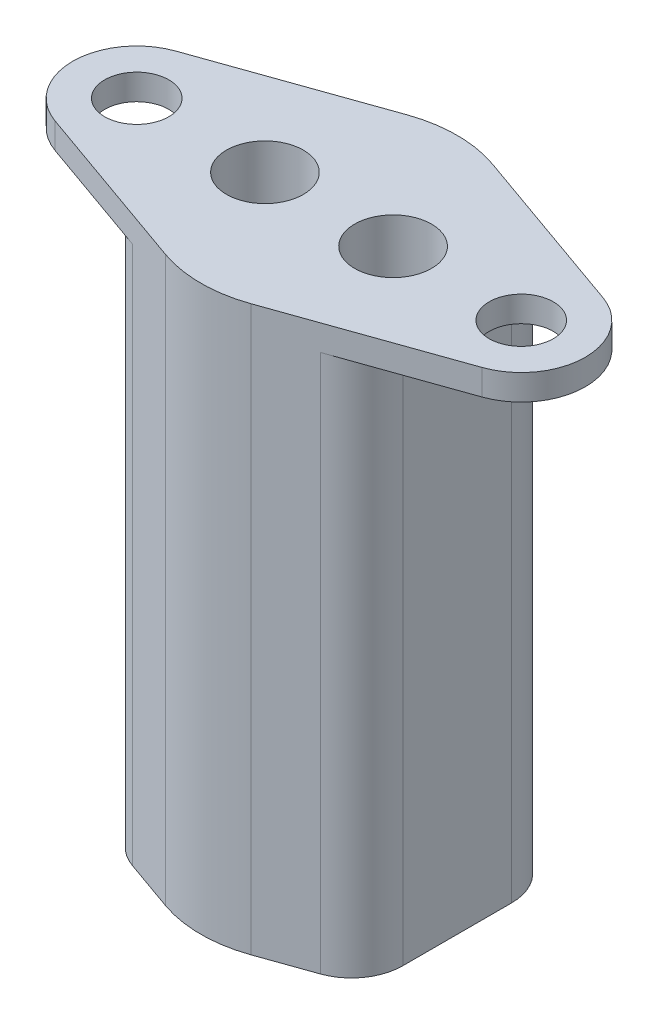
ISO-10303-21;
HEADER;
FILE_DESCRIPTION(('STEP AP214'),'2;1');
FILE_NAME('part.step','',(''),(''),'','','');
FILE_SCHEMA(('AUTOMOTIVE_DESIGN { 1 0 10303 214 1 1 1 1 }'));
ENDSEC;
DATA;
#1=APPLICATION_CONTEXT('core data for automotive mechanical design processes');
#2=APPLICATION_PROTOCOL_DEFINITION('international standard','automotive_design',2000,#1);
#3=PRODUCT_CONTEXT('',#1,'mechanical');
#4=PRODUCT('Part','Part','',(#3));
#5=PRODUCT_RELATED_PRODUCT_CATEGORY('part','',(#4));
#6=PRODUCT_DEFINITION_FORMATION('','',#4);
#7=PRODUCT_DEFINITION_CONTEXT('part definition',#1,'design');
#8=PRODUCT_DEFINITION('design','',#6,#7);
#9=PRODUCT_DEFINITION_SHAPE('','',#8);
#10=(LENGTH_UNIT() NAMED_UNIT(*) SI_UNIT(.MILLI.,.METRE.));
#11=(NAMED_UNIT(*) PLANE_ANGLE_UNIT() SI_UNIT($,.RADIAN.));
#12=(NAMED_UNIT(*) SI_UNIT($,.STERADIAN.) SOLID_ANGLE_UNIT());
#13=UNCERTAINTY_MEASURE_WITH_UNIT(LENGTH_MEASURE(1.E-05),#10,'distance_accuracy_value','');
#14=(GEOMETRIC_REPRESENTATION_CONTEXT(3) GLOBAL_UNCERTAINTY_ASSIGNED_CONTEXT((#13)) GLOBAL_UNIT_ASSIGNED_CONTEXT((#10,
#11,#12)) REPRESENTATION_CONTEXT('',''));
#15=CARTESIAN_POINT('',(0.,0.,0.));
#16=DIRECTION('',(0.,0.,1.));
#17=DIRECTION('',(1.,0.,0.));
#18=AXIS2_PLACEMENT_3D('',#15,#16,#17);
#19=CARTESIAN_POINT('',(-7.5,2.,0.));
#20=DIRECTION('',(0.,1.,0.));
#21=DIRECTION('',(0.,0.,1.));
#22=AXIS2_PLACEMENT_3D('',#19,#20,#21);
#23=PLANE('',#22);
#24=CARTESIAN_POINT('',(-2.5,2.,0.));
#25=DIRECTION('',(0.,-1.,0.));
#26=DIRECTION('',(0.,0.,-1.));
#27=AXIS2_PLACEMENT_3D('',#24,#25,#26);
#28=CIRCLE('',#27,1.5);
#29=CARTESIAN_POINT('',(-2.5,2.,-1.5));
#30=VERTEX_POINT('',#29);
#31=EDGE_CURVE('E186',#30,#30,#28,.T.);
#32=ORIENTED_EDGE('',*,*,#31,.T.);
#33=EDGE_LOOP('',(#32));
#34=FACE_BOUND('',#33,.T.);
#35=CARTESIAN_POINT('',(2.5,2.,0.));
#36=DIRECTION('',(0.,-1.,0.));
#37=DIRECTION('',(0.,0.,-1.));
#38=AXIS2_PLACEMENT_3D('',#35,#36,#37);
#39=CIRCLE('',#38,1.5);
#40=CARTESIAN_POINT('',(2.5,2.,-1.5));
#41=VERTEX_POINT('',#40);
#42=EDGE_CURVE('E633',#41,#41,#39,.T.);
#43=ORIENTED_EDGE('',*,*,#42,.T.);
#44=EDGE_LOOP('',(#43));
#45=FACE_BOUND('',#44,.T.);
#46=CARTESIAN_POINT('',(-7.5,2.,0.));
#47=DIRECTION('',(0.,1.,0.));
#48=DIRECTION('',(0.,0.,1.));
#49=AXIS2_PLACEMENT_3D('',#46,#47,#48);
#50=CIRCLE('',#49,1.25);
#51=CARTESIAN_POINT('',(-7.5,2.,1.25));
#52=VERTEX_POINT('',#51);
#53=EDGE_CURVE('E263',#52,#52,#50,.T.);
#54=ORIENTED_EDGE('',*,*,#53,.F.);
#55=EDGE_LOOP('',(#54));
#56=FACE_BOUND('',#55,.T.);
#57=CARTESIAN_POINT('',(-7.5,2.,0.));
#58=DIRECTION('',(0.,1.,0.));
#59=DIRECTION('',(0.,0.,1.));
#60=AXIS2_PLACEMENT_3D('',#57,#58,#59);
#61=CIRCLE('',#60,2.5);
#62=CARTESIAN_POINT('',(-8.33333333333333,2.,-2.35702260395516));
#63=VERTEX_POINT('',#62);
#64=CARTESIAN_POINT('',(-8.33333333333333,2.,2.35702260395516));
#65=VERTEX_POINT('',#64);
#66=EDGE_CURVE('E267',#63,#65,#61,.T.);
#67=ORIENTED_EDGE('',*,*,#66,.T.);
#68=DIRECTION('',(0.942809041582063,0.,0.333333333333333));
#69=VECTOR('',#68,1.);
#70=CARTESIAN_POINT('',(-8.33333333333333,2.,2.35702260395516));
#71=LINE('',#70,#69);
#72=CARTESIAN_POINT('',(-1.66666666666667,2.,4.71404520791032));
#73=VERTEX_POINT('',#72);
#74=EDGE_CURVE('E271',#65,#73,#71,.T.);
#75=ORIENTED_EDGE('',*,*,#74,.T.);
#76=CARTESIAN_POINT('',(0.,2.,0.));
#77=DIRECTION('',(0.,1.,0.));
#78=DIRECTION('',(0.,0.,1.));
#79=AXIS2_PLACEMENT_3D('',#76,#77,#78);
#80=CIRCLE('',#79,5.);
#81=CARTESIAN_POINT('',(1.66666666666667,2.,4.71404520791032));
#82=VERTEX_POINT('',#81);
#83=EDGE_CURVE('E274',#73,#82,#80,.T.);
#84=ORIENTED_EDGE('',*,*,#83,.T.);
#85=DIRECTION('',(0.942809041582063,0.,-0.333333333333334));
#86=VECTOR('',#85,1.);
#87=CARTESIAN_POINT('',(1.66666666666667,2.,4.71404520791032));
#88=LINE('',#87,#86);
#89=CARTESIAN_POINT('',(8.33333333333333,2.,2.35702260395515));
#90=VERTEX_POINT('',#89);
#91=EDGE_CURVE('E277',#82,#90,#88,.T.);
#92=ORIENTED_EDGE('',*,*,#91,.T.);
#93=CARTESIAN_POINT('',(7.5,2.,0.));
#94=DIRECTION('',(0.,1.,0.));
#95=DIRECTION('',(0.,0.,1.));
#96=AXIS2_PLACEMENT_3D('',#93,#94,#95);
#97=CIRCLE('',#96,2.5);
#98=CARTESIAN_POINT('',(8.33333333333333,2.,-2.35702260395516));
#99=VERTEX_POINT('',#98);
#100=EDGE_CURVE('E280',#90,#99,#97,.T.);
#101=ORIENTED_EDGE('',*,*,#100,.T.);
#102=DIRECTION('',(-0.942809041582063,0.,-0.333333333333333));
#103=VECTOR('',#102,1.);
#104=CARTESIAN_POINT('',(1.66666666666666,2.,-4.71404520791032));
#105=LINE('',#104,#103);
#106=CARTESIAN_POINT('',(1.66666666666666,2.,-4.71404520791032));
#107=VERTEX_POINT('',#106);
#108=EDGE_CURVE('E283',#99,#107,#105,.T.);
#109=ORIENTED_EDGE('',*,*,#108,.T.);
#110=CARTESIAN_POINT('',(0.,2.,0.));
#111=DIRECTION('',(0.,1.,0.));
#112=DIRECTION('',(0.,0.,1.));
#113=AXIS2_PLACEMENT_3D('',#110,#111,#112);
#114=CIRCLE('',#113,5.);
#115=CARTESIAN_POINT('',(-1.66666666666667,2.,-4.71404520791032));
#116=VERTEX_POINT('',#115);
#117=EDGE_CURVE('E286',#107,#116,#114,.T.);
#118=ORIENTED_EDGE('',*,*,#117,.T.);
#119=DIRECTION('',(-0.942809041582063,0.,0.333333333333333));
#120=VECTOR('',#119,1.);
#121=CARTESIAN_POINT('',(-8.33333333333333,2.,-2.35702260395516));
#122=LINE('',#121,#120);
#123=EDGE_CURVE('E289',#116,#63,#122,.T.);
#124=ORIENTED_EDGE('',*,*,#123,.T.);
#125=EDGE_LOOP('',(#67,#75,#84,#92,#101,#109,#118,#124));
#126=FACE_BOUND('',#125,.T.);
#127=CARTESIAN_POINT('',(7.5,2.,0.));
#128=DIRECTION('',(0.,1.,0.));
#129=DIRECTION('',(0.,0.,1.));
#130=AXIS2_PLACEMENT_3D('',#127,#128,#129);
#131=CIRCLE('',#130,1.25);
#132=CARTESIAN_POINT('',(7.5,2.,1.25));
#133=VERTEX_POINT('',#132);
#134=EDGE_CURVE('E259',#133,#133,#131,.T.);
#135=ORIENTED_EDGE('',*,*,#134,.F.);
#136=EDGE_LOOP('',(#135));
#137=FACE_BOUND('',#136,.T.);
#138=ADVANCED_FACE('F41',(#34,#45,#56,#126,#137),#23,.T.);
#139=CARTESIAN_POINT('',(-7.5,2.,0.));
#140=DIRECTION('',(0.,-1.,0.));
#141=DIRECTION('',(0.,0.,-1.));
#142=AXIS2_PLACEMENT_3D('',#139,#140,#141);
#143=CYLINDRICAL_SURFACE('',#142,2.5);
#144=DIRECTION('',(0.,-1.,0.));
#145=VECTOR('',#144,1.);
#146=CARTESIAN_POINT('',(-8.33333333333333,2.,-2.35702260395516));
#147=LINE('',#146,#145);
#148=CARTESIAN_POINT('',(-8.33333333333333,1.,-2.35702260395516));
#149=VERTEX_POINT('',#148);
#150=EDGE_CURVE('E292',#63,#149,#147,.T.);
#151=ORIENTED_EDGE('',*,*,#150,.T.);
#152=CARTESIAN_POINT('',(-7.5,1.,0.));
#153=DIRECTION('',(0.,1.,0.));
#154=DIRECTION('',(0.,0.,1.));
#155=AXIS2_PLACEMENT_3D('',#152,#153,#154);
#156=CIRCLE('',#155,2.5);
#157=CARTESIAN_POINT('',(-8.33333333333333,1.,2.35702260395516));
#158=VERTEX_POINT('',#157);
#159=EDGE_CURVE('E253',#149,#158,#156,.T.);
#160=ORIENTED_EDGE('',*,*,#159,.T.);
#161=DIRECTION('',(0.,-1.,0.));
#162=VECTOR('',#161,1.);
#163=CARTESIAN_POINT('',(-8.33333333333333,2.,2.35702260395516));
#164=LINE('',#163,#162);
#165=EDGE_CURVE('E316',#65,#158,#164,.T.);
#166=ORIENTED_EDGE('',*,*,#165,.F.);
#167=ORIENTED_EDGE('',*,*,#66,.F.);
#168=EDGE_LOOP('',(#151,#160,#166,#167));
#169=FACE_BOUND('',#168,.T.);
#170=ADVANCED_FACE('F398',(#169),#143,.T.);
#171=CARTESIAN_POINT('',(-8.33333333333333,2.,2.35702260395516));
#172=DIRECTION('',(0.333333333333333,0.,-0.942809041582063));
#173=DIRECTION('',(-0.942809041582063,0.,-0.333333333333333));
#174=AXIS2_PLACEMENT_3D('',#171,#172,#173);
#175=PLANE('',#174);
#176=DIRECTION('',(0.942809041582063,0.,0.333333333333333));
#177=VECTOR('',#176,1.);
#178=CARTESIAN_POINT('',(-8.33333333333333,1.,2.35702260395516));
#179=LINE('',#178,#177);
#180=CARTESIAN_POINT('',(-3.66666666666667,1.,4.00693842672377));
#181=VERTEX_POINT('',#180);
#182=EDGE_CURVE('E57',#158,#181,#179,.T.);
#183=ORIENTED_EDGE('',*,*,#182,.T.);
#184=DIRECTION('',(0.,-1.,0.));
#185=VECTOR('',#184,1.);
#186=CARTESIAN_POINT('',(-3.66666666666667,2.,4.00693842672377));
#187=LINE('',#186,#185);
#188=CARTESIAN_POINT('',(-3.66666666666667,-20.,4.00693842672377));
#189=VERTEX_POINT('',#188);
#190=EDGE_CURVE('E342',#181,#189,#187,.T.);
#191=ORIENTED_EDGE('',*,*,#190,.T.);
#192=DIRECTION('',(-0.942809041582063,0.,-0.333333333333333));
#193=VECTOR('',#192,1.);
#194=CARTESIAN_POINT('',(-1.66666666666667,-20.,4.71404520791032));
#195=LINE('',#194,#193);
#196=CARTESIAN_POINT('',(-1.66666666666667,-20.,4.71404520791032));
#197=VERTEX_POINT('',#196);
#198=EDGE_CURVE('E206',#197,#189,#195,.T.);
#199=ORIENTED_EDGE('',*,*,#198,.F.);
#200=DIRECTION('',(0.,-1.,0.));
#201=VECTOR('',#200,1.);
#202=CARTESIAN_POINT('',(-1.66666666666667,2.,4.71404520791032));
#203=LINE('',#202,#201);
#204=EDGE_CURVE('E313',#73,#197,#203,.T.);
#205=ORIENTED_EDGE('',*,*,#204,.F.);
#206=ORIENTED_EDGE('',*,*,#74,.F.);
#207=ORIENTED_EDGE('',*,*,#165,.T.);
#208=EDGE_LOOP('',(#183,#191,#199,#205,#206,#207));
#209=FACE_BOUND('',#208,.T.);
#210=ADVANCED_FACE('F393',(#209),#175,.F.);
#211=CARTESIAN_POINT('',(0.,2.,0.));
#212=DIRECTION('',(0.,-1.,0.));
#213=DIRECTION('',(0.,0.,-1.));
#214=AXIS2_PLACEMENT_3D('',#211,#212,#213);
#215=CYLINDRICAL_SURFACE('',#214,5.);
#216=ORIENTED_EDGE('',*,*,#204,.T.);
#217=CARTESIAN_POINT('',(0.,-20.,0.));
#218=DIRECTION('',(0.,-1.,0.));
#219=DIRECTION('',(0.,0.,-1.));
#220=AXIS2_PLACEMENT_3D('',#217,#218,#219);
#221=CIRCLE('',#220,5.);
#222=CARTESIAN_POINT('',(1.66666666666667,-20.,4.71404520791032));
#223=VERTEX_POINT('',#222);
#224=EDGE_CURVE('E202',#223,#197,#221,.T.);
#225=ORIENTED_EDGE('',*,*,#224,.F.);
#226=DIRECTION('',(0.,-1.,0.));
#227=VECTOR('',#226,1.);
#228=CARTESIAN_POINT('',(1.66666666666667,2.,4.71404520791032));
#229=LINE('',#228,#227);
#230=EDGE_CURVE('E310',#82,#223,#229,.T.);
#231=ORIENTED_EDGE('',*,*,#230,.F.);
#232=ORIENTED_EDGE('',*,*,#83,.F.);
#233=EDGE_LOOP('',(#216,#225,#231,#232));
#234=FACE_BOUND('',#233,.T.);
#235=ADVANCED_FACE('F389',(#234),#215,.T.);
#236=CARTESIAN_POINT('',(1.66666666666667,2.,4.71404520791032));
#237=DIRECTION('',(-0.333333333333334,0.,-0.942809041582063));
#238=DIRECTION('',(-0.942809041582063,0.,0.333333333333334));
#239=AXIS2_PLACEMENT_3D('',#236,#237,#238);
#240=PLANE('',#239);
#241=ORIENTED_EDGE('',*,*,#230,.T.);
#242=DIRECTION('',(-0.942809041582063,0.,0.333333333333334));
#243=VECTOR('',#242,1.);
#244=CARTESIAN_POINT('',(3.66666666666667,-20.,4.00693842672377));
#245=LINE('',#244,#243);
#246=CARTESIAN_POINT('',(3.66666666666667,-20.,4.00693842672377));
#247=VERTEX_POINT('',#246);
#248=EDGE_CURVE('E198',#247,#223,#245,.T.);
#249=ORIENTED_EDGE('',*,*,#248,.F.);
#250=DIRECTION('',(0.,1.,0.));
#251=VECTOR('',#250,1.);
#252=CARTESIAN_POINT('',(3.66666666666667,2.,4.00693842672377));
#253=LINE('',#252,#251);
#254=CARTESIAN_POINT('',(3.66666666666667,1.,4.00693842672377));
#255=VERTEX_POINT('',#254);
#256=EDGE_CURVE('E168',#247,#255,#253,.T.);
#257=ORIENTED_EDGE('',*,*,#256,.T.);
#258=DIRECTION('',(0.942809041582063,0.,-0.333333333333334));
#259=VECTOR('',#258,1.);
#260=CARTESIAN_POINT('',(1.66666666666667,1.,4.71404520791032));
#261=LINE('',#260,#259);
#262=CARTESIAN_POINT('',(8.33333333333333,1.,2.35702260395515));
#263=VERTEX_POINT('',#262);
#264=EDGE_CURVE('E244',#255,#263,#261,.T.);
#265=ORIENTED_EDGE('',*,*,#264,.T.);
#266=DIRECTION('',(0.,-1.,0.));
#267=VECTOR('',#266,1.);
#268=CARTESIAN_POINT('',(8.33333333333333,2.,2.35702260395515));
#269=LINE('',#268,#267);
#270=EDGE_CURVE('E306',#90,#263,#269,.T.);
#271=ORIENTED_EDGE('',*,*,#270,.F.);
#272=ORIENTED_EDGE('',*,*,#91,.F.);
#273=EDGE_LOOP('',(#241,#249,#257,#265,#271,#272));
#274=FACE_BOUND('',#273,.T.);
#275=ADVANCED_FACE('F383',(#274),#240,.F.);
#276=CARTESIAN_POINT('',(7.5,2.,0.));
#277=DIRECTION('',(0.,-1.,0.));
#278=DIRECTION('',(0.,0.,-1.));
#279=AXIS2_PLACEMENT_3D('',#276,#277,#278);
#280=CYLINDRICAL_SURFACE('',#279,2.5);
#281=CARTESIAN_POINT('',(7.5,1.,0.));
#282=DIRECTION('',(0.,1.,0.));
#283=DIRECTION('',(0.,0.,1.));
#284=AXIS2_PLACEMENT_3D('',#281,#282,#283);
#285=CIRCLE('',#284,2.5);
#286=CARTESIAN_POINT('',(8.33333333333333,1.,-2.35702260395516));
#287=VERTEX_POINT('',#286);
#288=EDGE_CURVE('E241',#263,#287,#285,.T.);
#289=ORIENTED_EDGE('',*,*,#288,.T.);
#290=DIRECTION('',(0.,-1.,0.));
#291=VECTOR('',#290,1.);
#292=CARTESIAN_POINT('',(8.33333333333333,2.,-2.35702260395516));
#293=LINE('',#292,#291);
#294=EDGE_CURVE('E302',#99,#287,#293,.T.);
#295=ORIENTED_EDGE('',*,*,#294,.F.);
#296=ORIENTED_EDGE('',*,*,#100,.F.);
#297=ORIENTED_EDGE('',*,*,#270,.T.);
#298=EDGE_LOOP('',(#289,#295,#296,#297));
#299=FACE_BOUND('',#298,.T.);
#300=ADVANCED_FACE('F404',(#299),#280,.T.);
#301=CARTESIAN_POINT('',(1.66666666666666,2.,-4.71404520791032));
#302=DIRECTION('',(-0.333333333333333,0.,0.942809041582063));
#303=DIRECTION('',(0.942809041582064,0.,0.333333333333333));
#304=AXIS2_PLACEMENT_3D('',#301,#302,#303);
#305=PLANE('',#304);
#306=DIRECTION('',(-0.942809041582064,0.,-0.333333333333333));
#307=VECTOR('',#306,1.);
#308=CARTESIAN_POINT('',(1.66666666666666,1.,-4.71404520791032));
#309=LINE('',#308,#307);
#310=CARTESIAN_POINT('',(3.66666666666667,1.,-4.00693842672377));
#311=VERTEX_POINT('',#310);
#312=EDGE_CURVE('E238',#287,#311,#309,.T.);
#313=ORIENTED_EDGE('',*,*,#312,.T.);
#314=DIRECTION('',(0.,-1.,0.));
#315=VECTOR('',#314,1.);
#316=CARTESIAN_POINT('',(3.66666666666666,2.,-4.00693842672377));
#317=LINE('',#316,#315);
#318=CARTESIAN_POINT('',(3.66666666666666,-20.,-4.00693842672377));
#319=VERTEX_POINT('',#318);
#320=EDGE_CURVE('E330',#311,#319,#317,.T.);
#321=ORIENTED_EDGE('',*,*,#320,.T.);
#322=DIRECTION('',(0.942809041582063,0.,0.333333333333334));
#323=VECTOR('',#322,1.);
#324=CARTESIAN_POINT('',(1.66666666666666,-20.,-4.71404520791032));
#325=LINE('',#324,#323);
#326=CARTESIAN_POINT('',(1.66666666666666,-20.,-4.71404520791032));
#327=VERTEX_POINT('',#326);
#328=EDGE_CURVE('E184',#327,#319,#325,.T.);
#329=ORIENTED_EDGE('',*,*,#328,.F.);
#330=DIRECTION('',(0.,-1.,0.));
#331=VECTOR('',#330,1.);
#332=CARTESIAN_POINT('',(1.66666666666666,2.,-4.71404520791032));
#333=LINE('',#332,#331);
#334=EDGE_CURVE('E299',#107,#327,#333,.T.);
#335=ORIENTED_EDGE('',*,*,#334,.F.);
#336=ORIENTED_EDGE('',*,*,#108,.F.);
#337=ORIENTED_EDGE('',*,*,#294,.T.);
#338=EDGE_LOOP('',(#313,#321,#329,#335,#336,#337));
#339=FACE_BOUND('',#338,.T.);
#340=ADVANCED_FACE('F371',(#339),#305,.F.);
#341=CARTESIAN_POINT('',(0.,2.,0.));
#342=DIRECTION('',(0.,-1.,0.));
#343=DIRECTION('',(0.,0.,-1.));
#344=AXIS2_PLACEMENT_3D('',#341,#342,#343);
#345=CYLINDRICAL_SURFACE('',#344,5.);
#346=ORIENTED_EDGE('',*,*,#334,.T.);
#347=CARTESIAN_POINT('',(0.,-20.,0.));
#348=DIRECTION('',(0.,-1.,0.));
#349=DIRECTION('',(0.,0.,-1.));
#350=AXIS2_PLACEMENT_3D('',#347,#348,#349);
#351=CIRCLE('',#350,5.);
#352=CARTESIAN_POINT('',(-1.66666666666667,-20.,-4.71404520791032));
#353=VERTEX_POINT('',#352);
#354=EDGE_CURVE('E226',#353,#327,#351,.T.);
#355=ORIENTED_EDGE('',*,*,#354,.F.);
#356=DIRECTION('',(0.,-1.,0.));
#357=VECTOR('',#356,1.);
#358=CARTESIAN_POINT('',(-1.66666666666667,2.,-4.71404520791032));
#359=LINE('',#358,#357);
#360=EDGE_CURVE('E296',#116,#353,#359,.T.);
#361=ORIENTED_EDGE('',*,*,#360,.F.);
#362=ORIENTED_EDGE('',*,*,#117,.F.);
#363=EDGE_LOOP('',(#346,#355,#361,#362));
#364=FACE_BOUND('',#363,.T.);
#365=ADVANCED_FACE('F368',(#364),#345,.T.);
#366=CARTESIAN_POINT('',(-8.33333333333333,2.,-2.35702260395516));
#367=DIRECTION('',(0.333333333333333,0.,0.942809041582063));
#368=DIRECTION('',(0.942809041582063,0.,-0.333333333333333));
#369=AXIS2_PLACEMENT_3D('',#366,#367,#368);
#370=PLANE('',#369);
#371=ORIENTED_EDGE('',*,*,#360,.T.);
#372=DIRECTION('',(0.942809041582063,0.,-0.333333333333333));
#373=VECTOR('',#372,1.);
#374=CARTESIAN_POINT('',(-3.66666666666667,-20.,-4.00693842672377));
#375=LINE('',#374,#373);
#376=CARTESIAN_POINT('',(-3.66666666666667,-20.,-4.00693842672377));
#377=VERTEX_POINT('',#376);
#378=EDGE_CURVE('E222',#377,#353,#375,.T.);
#379=ORIENTED_EDGE('',*,*,#378,.F.);
#380=DIRECTION('',(0.,1.,0.));
#381=VECTOR('',#380,1.);
#382=CARTESIAN_POINT('',(-3.66666666666667,2.,-4.00693842672377));
#383=LINE('',#382,#381);
#384=CARTESIAN_POINT('',(-3.66666666666667,1.,-4.00693842672377));
#385=VERTEX_POINT('',#384);
#386=EDGE_CURVE('E333',#377,#385,#383,.T.);
#387=ORIENTED_EDGE('',*,*,#386,.T.);
#388=DIRECTION('',(-0.942809041582063,0.,0.333333333333333));
#389=VECTOR('',#388,1.);
#390=CARTESIAN_POINT('',(-8.33333333333333,1.,-2.35702260395516));
#391=LINE('',#390,#389);
#392=EDGE_CURVE('E249',#385,#149,#391,.T.);
#393=ORIENTED_EDGE('',*,*,#392,.T.);
#394=ORIENTED_EDGE('',*,*,#150,.F.);
#395=ORIENTED_EDGE('',*,*,#123,.F.);
#396=EDGE_LOOP('',(#371,#379,#387,#393,#394,#395));
#397=FACE_BOUND('',#396,.T.);
#398=ADVANCED_FACE('F362',(#397),#370,.F.);
#399=CARTESIAN_POINT('',(-7.5,2.,0.));
#400=DIRECTION('',(0.,-1.,0.));
#401=DIRECTION('',(0.,0.,-1.));
#402=AXIS2_PLACEMENT_3D('',#399,#400,#401);
#403=CYLINDRICAL_SURFACE('',#402,1.25);
#404=CARTESIAN_POINT('',(-7.5,1.,0.));
#405=DIRECTION('',(0.,1.,0.));
#406=DIRECTION('',(0.,0.,1.));
#407=AXIS2_PLACEMENT_3D('',#404,#405,#406);
#408=CIRCLE('',#407,1.25);
#409=CARTESIAN_POINT('',(-7.5,1.,1.25));
#410=VERTEX_POINT('',#409);
#411=EDGE_CURVE('E248',#410,#410,#408,.T.);
#412=ORIENTED_EDGE('',*,*,#411,.F.);
#413=EDGE_LOOP('',(#412));
#414=FACE_BOUND('',#413,.T.);
#415=ORIENTED_EDGE('',*,*,#53,.T.);
#416=EDGE_LOOP('',(#415));
#417=FACE_BOUND('',#416,.T.);
#418=ADVANCED_FACE('F423',(#414,#417),#403,.F.);
#419=CARTESIAN_POINT('',(7.5,2.,0.));
#420=DIRECTION('',(0.,-1.,0.));
#421=DIRECTION('',(0.,0.,-1.));
#422=AXIS2_PLACEMENT_3D('',#419,#420,#421);
#423=CYLINDRICAL_SURFACE('',#422,1.25);
#424=CARTESIAN_POINT('',(7.5,1.,0.));
#425=DIRECTION('',(0.,1.,0.));
#426=DIRECTION('',(0.,0.,1.));
#427=AXIS2_PLACEMENT_3D('',#424,#425,#426);
#428=CIRCLE('',#427,1.25);
#429=CARTESIAN_POINT('',(7.5,1.,1.25));
#430=VERTEX_POINT('',#429);
#431=EDGE_CURVE('E235',#430,#430,#428,.T.);
#432=ORIENTED_EDGE('',*,*,#431,.F.);
#433=EDGE_LOOP('',(#432));
#434=FACE_BOUND('',#433,.T.);
#435=ORIENTED_EDGE('',*,*,#134,.T.);
#436=EDGE_LOOP('',(#435));
#437=FACE_BOUND('',#436,.T.);
#438=ADVANCED_FACE('F443',(#434,#437),#423,.F.);
#439=CARTESIAN_POINT('',(5.,0.,-5.));
#440=DIRECTION('',(-1.,0.,0.));
#441=DIRECTION('',(0.,0.,1.));
#442=AXIS2_PLACEMENT_3D('',#439,#440,#441);
#443=PLANE('',#442);
#444=DIRECTION('',(0.,0.,1.));
#445=VECTOR('',#444,1.);
#446=CARTESIAN_POINT('',(5.,1.,-5.));
#447=LINE('',#446,#445);
#448=CARTESIAN_POINT('',(5.,1.,-2.12132034355964));
#449=VERTEX_POINT('',#448);
#450=CARTESIAN_POINT('',(5.,1.,2.12132034355964));
#451=VERTEX_POINT('',#450);
#452=EDGE_CURVE('E231',#449,#451,#447,.T.);
#453=ORIENTED_EDGE('',*,*,#452,.T.);
#454=DIRECTION('',(0.,1.,0.));
#455=VECTOR('',#454,1.);
#456=CARTESIAN_POINT('',(5.,0.,2.12132034355964));
#457=LINE('',#456,#455);
#458=CARTESIAN_POINT('',(5.,-20.,2.12132034355964));
#459=VERTEX_POINT('',#458);
#460=EDGE_CURVE('E167',#451,#459,#457,.F.);
#461=ORIENTED_EDGE('',*,*,#460,.T.);
#462=DIRECTION('',(0.,0.,1.));
#463=VECTOR('',#462,1.);
#464=CARTESIAN_POINT('',(5.,-20.,-2.12132034355964));
#465=LINE('',#464,#463);
#466=CARTESIAN_POINT('',(5.,-20.,-2.12132034355964));
#467=VERTEX_POINT('',#466);
#468=EDGE_CURVE('E171',#467,#459,#465,.T.);
#469=ORIENTED_EDGE('',*,*,#468,.F.);
#470=DIRECTION('',(0.,-1.,0.));
#471=VECTOR('',#470,1.);
#472=CARTESIAN_POINT('',(5.,0.,-2.12132034355964));
#473=LINE('',#472,#471);
#474=EDGE_CURVE('E155',#467,#449,#473,.F.);
#475=ORIENTED_EDGE('',*,*,#474,.T.);
#476=EDGE_LOOP('',(#453,#461,#469,#475));
#477=FACE_BOUND('',#476,.T.);
#478=ADVANCED_FACE('F172',(#477),#443,.F.);
#479=CARTESIAN_POINT('',(5.,1.,-5.));
#480=DIRECTION('',(0.,1.,0.));
#481=DIRECTION('',(0.,0.,1.));
#482=AXIS2_PLACEMENT_3D('',#479,#480,#481);
#483=PLANE('',#482);
#484=ORIENTED_EDGE('',*,*,#431,.T.);
#485=EDGE_LOOP('',(#484));
#486=FACE_BOUND('',#485,.T.);
#487=ORIENTED_EDGE('',*,*,#452,.F.);
#488=CARTESIAN_POINT('',(3.,1.,-2.12132034355964));
#489=DIRECTION('',(0.,1.,0.));
#490=DIRECTION('',(0.,0.,1.));
#491=AXIS2_PLACEMENT_3D('',#488,#489,#490);
#492=CIRCLE('',#491,2.);
#493=EDGE_CURVE('E162',#449,#311,#492,.T.);
#494=ORIENTED_EDGE('',*,*,#493,.T.);
#495=ORIENTED_EDGE('',*,*,#312,.F.);
#496=ORIENTED_EDGE('',*,*,#288,.F.);
#497=ORIENTED_EDGE('',*,*,#264,.F.);
#498=CARTESIAN_POINT('',(3.,1.,2.12132034355964));
#499=DIRECTION('',(0.,1.,0.));
#500=DIRECTION('',(0.,0.,1.));
#501=AXIS2_PLACEMENT_3D('',#498,#499,#500);
#502=CIRCLE('',#501,2.);
#503=EDGE_CURVE('E345',#255,#451,#502,.T.);
#504=ORIENTED_EDGE('',*,*,#503,.T.);
#505=EDGE_LOOP('',(#487,#494,#495,#496,#497,#504));
#506=FACE_BOUND('',#505,.T.);
#507=ADVANCED_FACE('F376',(#486,#506),#483,.F.);
#508=CARTESIAN_POINT('',(-5.,1.,-5.));
#509=DIRECTION('',(1.,0.,0.));
#510=DIRECTION('',(0.,0.,-1.));
#511=AXIS2_PLACEMENT_3D('',#508,#509,#510);
#512=PLANE('',#511);
#513=DIRECTION('',(0.,0.,1.));
#514=VECTOR('',#513,1.);
#515=CARTESIAN_POINT('',(-5.,1.,-5.));
#516=LINE('',#515,#514);
#517=CARTESIAN_POINT('',(-5.,1.,-2.12132034355964));
#518=VERTEX_POINT('',#517);
#519=CARTESIAN_POINT('',(-5.,1.,2.12132034355964));
#520=VERTEX_POINT('',#519);
#521=EDGE_CURVE('E232',#518,#520,#516,.T.);
#522=ORIENTED_EDGE('',*,*,#521,.F.);
#523=DIRECTION('',(0.,1.,0.));
#524=VECTOR('',#523,1.);
#525=CARTESIAN_POINT('',(-5.,1.,-2.12132034355964));
#526=LINE('',#525,#524);
#527=CARTESIAN_POINT('',(-5.,-20.,-2.12132034355964));
#528=VERTEX_POINT('',#527);
#529=EDGE_CURVE('E339',#518,#528,#526,.F.);
#530=ORIENTED_EDGE('',*,*,#529,.T.);
#531=DIRECTION('',(0.,0.,-1.));
#532=VECTOR('',#531,1.);
#533=CARTESIAN_POINT('',(-5.,-20.,2.12132034355964));
#534=LINE('',#533,#532);
#535=CARTESIAN_POINT('',(-5.,-20.,2.12132034355964));
#536=VERTEX_POINT('',#535);
#537=EDGE_CURVE('E214',#536,#528,#534,.T.);
#538=ORIENTED_EDGE('',*,*,#537,.F.);
#539=DIRECTION('',(0.,-1.,0.));
#540=VECTOR('',#539,1.);
#541=CARTESIAN_POINT('',(-5.,1.,2.12132034355964));
#542=LINE('',#541,#540);
#543=EDGE_CURVE('E64',#536,#520,#542,.F.);
#544=ORIENTED_EDGE('',*,*,#543,.T.);
#545=EDGE_LOOP('',(#522,#530,#538,#544));
#546=FACE_BOUND('',#545,.T.);
#547=ADVANCED_FACE('F356',(#546),#512,.F.);
#548=CARTESIAN_POINT('',(-10.,1.,-5.));
#549=DIRECTION('',(0.,1.,0.));
#550=DIRECTION('',(0.,0.,1.));
#551=AXIS2_PLACEMENT_3D('',#548,#549,#550);
#552=PLANE('',#551);
#553=ORIENTED_EDGE('',*,*,#411,.T.);
#554=EDGE_LOOP('',(#553));
#555=FACE_BOUND('',#554,.T.);
#556=ORIENTED_EDGE('',*,*,#159,.F.);
#557=ORIENTED_EDGE('',*,*,#392,.F.);
#558=CARTESIAN_POINT('',(-3.,1.,-2.12132034355964));
#559=DIRECTION('',(0.,1.,0.));
#560=DIRECTION('',(0.,0.,1.));
#561=AXIS2_PLACEMENT_3D('',#558,#559,#560);
#562=CIRCLE('',#561,2.);
#563=EDGE_CURVE('E50',#385,#518,#562,.T.);
#564=ORIENTED_EDGE('',*,*,#563,.T.);
#565=ORIENTED_EDGE('',*,*,#521,.T.);
#566=CARTESIAN_POINT('',(-3.,1.,2.12132034355964));
#567=DIRECTION('',(0.,1.,0.));
#568=DIRECTION('',(0.,0.,1.));
#569=AXIS2_PLACEMENT_3D('',#566,#567,#568);
#570=CIRCLE('',#569,2.);
#571=EDGE_CURVE('E11',#520,#181,#570,.T.);
#572=ORIENTED_EDGE('',*,*,#571,.T.);
#573=ORIENTED_EDGE('',*,*,#182,.F.);
#574=EDGE_LOOP('',(#556,#557,#564,#565,#572,#573));
#575=FACE_BOUND('',#574,.T.);
#576=ADVANCED_FACE('F352',(#555,#575),#552,.F.);
#577=CARTESIAN_POINT('',(3.,2.,2.12132034355964));
#578=DIRECTION('',(0.,1.,0.));
#579=DIRECTION('',(0.,0.,1.));
#580=AXIS2_PLACEMENT_3D('',#577,#578,#579);
#581=CYLINDRICAL_SURFACE('',#580,2.);
#582=ORIENTED_EDGE('',*,*,#256,.F.);
#583=CARTESIAN_POINT('',(3.,-20.,2.12132034355964));
#584=DIRECTION('',(0.,-1.,0.));
#585=DIRECTION('',(0.,0.,-1.));
#586=AXIS2_PLACEMENT_3D('',#583,#584,#585);
#587=CIRCLE('',#586,2.);
#588=EDGE_CURVE('E178',#459,#247,#587,.T.);
#589=ORIENTED_EDGE('',*,*,#588,.F.);
#590=ORIENTED_EDGE('',*,*,#460,.F.);
#591=ORIENTED_EDGE('',*,*,#503,.F.);
#592=EDGE_LOOP('',(#582,#589,#590,#591));
#593=FACE_BOUND('',#592,.T.);
#594=ADVANCED_FACE('F379',(#593),#581,.T.);
#595=CARTESIAN_POINT('',(3.,2.,-2.12132034355964));
#596=DIRECTION('',(0.,-1.,0.));
#597=DIRECTION('',(0.,0.,-1.));
#598=AXIS2_PLACEMENT_3D('',#595,#596,#597);
#599=CYLINDRICAL_SURFACE('',#598,2.);
#600=ORIENTED_EDGE('',*,*,#493,.F.);
#601=ORIENTED_EDGE('',*,*,#474,.F.);
#602=CARTESIAN_POINT('',(3.,-20.,-2.12132034355964));
#603=DIRECTION('',(0.,-1.,0.));
#604=DIRECTION('',(0.,0.,-1.));
#605=AXIS2_PLACEMENT_3D('',#602,#603,#604);
#606=CIRCLE('',#605,2.);
#607=EDGE_CURVE('E160',#319,#467,#606,.T.);
#608=ORIENTED_EDGE('',*,*,#607,.F.);
#609=ORIENTED_EDGE('',*,*,#320,.F.);
#610=EDGE_LOOP('',(#600,#601,#608,#609));
#611=FACE_BOUND('',#610,.T.);
#612=ADVANCED_FACE('F157',(#611),#599,.T.);
#613=CARTESIAN_POINT('',(-3.,2.,-2.12132034355964));
#614=DIRECTION('',(0.,1.,0.));
#615=DIRECTION('',(0.,0.,1.));
#616=AXIS2_PLACEMENT_3D('',#613,#614,#615);
#617=CYLINDRICAL_SURFACE('',#616,2.);
#618=ORIENTED_EDGE('',*,*,#386,.F.);
#619=CARTESIAN_POINT('',(-3.,-20.,-2.12132034355964));
#620=DIRECTION('',(0.,-1.,0.));
#621=DIRECTION('',(0.,0.,-1.));
#622=AXIS2_PLACEMENT_3D('',#619,#620,#621);
#623=CIRCLE('',#622,2.);
#624=EDGE_CURVE('E218',#528,#377,#623,.T.);
#625=ORIENTED_EDGE('',*,*,#624,.F.);
#626=ORIENTED_EDGE('',*,*,#529,.F.);
#627=ORIENTED_EDGE('',*,*,#563,.F.);
#628=EDGE_LOOP('',(#618,#625,#626,#627));
#629=FACE_BOUND('',#628,.T.);
#630=ADVANCED_FACE('F358',(#629),#617,.T.);
#631=CARTESIAN_POINT('',(-3.,2.,2.12132034355964));
#632=DIRECTION('',(0.,-1.,0.));
#633=DIRECTION('',(0.,0.,-1.));
#634=AXIS2_PLACEMENT_3D('',#631,#632,#633);
#635=CYLINDRICAL_SURFACE('',#634,2.);
#636=ORIENTED_EDGE('',*,*,#571,.F.);
#637=ORIENTED_EDGE('',*,*,#543,.F.);
#638=CARTESIAN_POINT('',(-3.,-20.,2.12132034355964));
#639=DIRECTION('',(0.,-1.,0.));
#640=DIRECTION('',(0.,0.,-1.));
#641=AXIS2_PLACEMENT_3D('',#638,#639,#640);
#642=CIRCLE('',#641,2.);
#643=EDGE_CURVE('E210',#189,#536,#642,.T.);
#644=ORIENTED_EDGE('',*,*,#643,.F.);
#645=ORIENTED_EDGE('',*,*,#190,.F.);
#646=EDGE_LOOP('',(#636,#637,#644,#645));
#647=FACE_BOUND('',#646,.T.);
#648=ADVANCED_FACE('F43',(#647),#635,.T.);
#649=CARTESIAN_POINT('',(3.,-20.,-2.12132034355964));
#650=DIRECTION('',(0.,-1.,0.));
#651=DIRECTION('',(0.,0.,-1.));
#652=AXIS2_PLACEMENT_3D('',#649,#650,#651);
#653=PLANE('',#652);
#654=CARTESIAN_POINT('',(-2.5,-20.,0.));
#655=DIRECTION('',(0.,-1.,0.));
#656=DIRECTION('',(0.,0.,-1.));
#657=AXIS2_PLACEMENT_3D('',#654,#655,#656);
#658=CIRCLE('',#657,1.5);
#659=CARTESIAN_POINT('',(-2.5,-20.,-1.5));
#660=VERTEX_POINT('',#659);
#661=EDGE_CURVE('E190',#660,#660,#658,.T.);
#662=ORIENTED_EDGE('',*,*,#661,.F.);
#663=EDGE_LOOP('',(#662));
#664=FACE_BOUND('',#663,.T.);
#665=CARTESIAN_POINT('',(2.5,-20.,0.));
#666=DIRECTION('',(0.,-1.,0.));
#667=DIRECTION('',(0.,0.,-1.));
#668=AXIS2_PLACEMENT_3D('',#665,#666,#667);
#669=CIRCLE('',#668,1.5);
#670=CARTESIAN_POINT('',(2.5,-20.,-1.5));
#671=VERTEX_POINT('',#670);
#672=EDGE_CURVE('E193',#671,#671,#669,.T.);
#673=ORIENTED_EDGE('',*,*,#672,.F.);
#674=EDGE_LOOP('',(#673));
#675=FACE_BOUND('',#674,.T.);
#676=ORIENTED_EDGE('',*,*,#607,.T.);
#677=ORIENTED_EDGE('',*,*,#468,.T.);
#678=ORIENTED_EDGE('',*,*,#588,.T.);
#679=ORIENTED_EDGE('',*,*,#248,.T.);
#680=ORIENTED_EDGE('',*,*,#224,.T.);
#681=ORIENTED_EDGE('',*,*,#198,.T.);
#682=ORIENTED_EDGE('',*,*,#643,.T.);
#683=ORIENTED_EDGE('',*,*,#537,.T.);
#684=ORIENTED_EDGE('',*,*,#624,.T.);
#685=ORIENTED_EDGE('',*,*,#378,.T.);
#686=ORIENTED_EDGE('',*,*,#354,.T.);
#687=ORIENTED_EDGE('',*,*,#328,.T.);
#688=EDGE_LOOP('',(#676,#677,#678,#679,#680,#681,#682,#683,#684,#685,#686,#687));
#689=FACE_BOUND('',#688,.T.);
#690=ADVANCED_FACE('F181',(#664,#675,#689),#653,.T.);
#691=CARTESIAN_POINT('',(2.5,2.,0.));
#692=DIRECTION('',(0.,-1.,0.));
#693=DIRECTION('',(0.,0.,-1.));
#694=AXIS2_PLACEMENT_3D('',#691,#692,#693);
#695=CYLINDRICAL_SURFACE('',#694,1.5);
#696=ORIENTED_EDGE('',*,*,#42,.F.);
#697=EDGE_LOOP('',(#696));
#698=FACE_BOUND('',#697,.T.);
#699=ORIENTED_EDGE('',*,*,#672,.T.);
#700=EDGE_LOOP('',(#699));
#701=FACE_BOUND('',#700,.T.);
#702=ADVANCED_FACE('F504',(#698,#701),#695,.F.);
#703=CARTESIAN_POINT('',(-2.5,2.,0.));
#704=DIRECTION('',(0.,-1.,0.));
#705=DIRECTION('',(0.,0.,-1.));
#706=AXIS2_PLACEMENT_3D('',#703,#704,#705);
#707=CYLINDRICAL_SURFACE('',#706,1.5);
#708=ORIENTED_EDGE('',*,*,#31,.F.);
#709=EDGE_LOOP('',(#708));
#710=FACE_BOUND('',#709,.T.);
#711=ORIENTED_EDGE('',*,*,#661,.T.);
#712=EDGE_LOOP('',(#711));
#713=FACE_BOUND('',#712,.T.);
#714=ADVANCED_FACE('F512',(#710,#713),#707,.F.);
#715=CLOSED_SHELL('',(#138,#170,#210,#235,#275,#300,#340,#365,#398,#418,#438,#478,#507,#547,
#576,#594,#612,#630,#648,#690,#702,#714));
#716=MANIFOLD_SOLID_BREP('B2',#715);
#717=ADVANCED_BREP_SHAPE_REPRESENTATION('',(#18,#716),#14);
#718=SHAPE_DEFINITION_REPRESENTATION(#9,#717);
ENDSEC;
END-ISO-10303-21;
